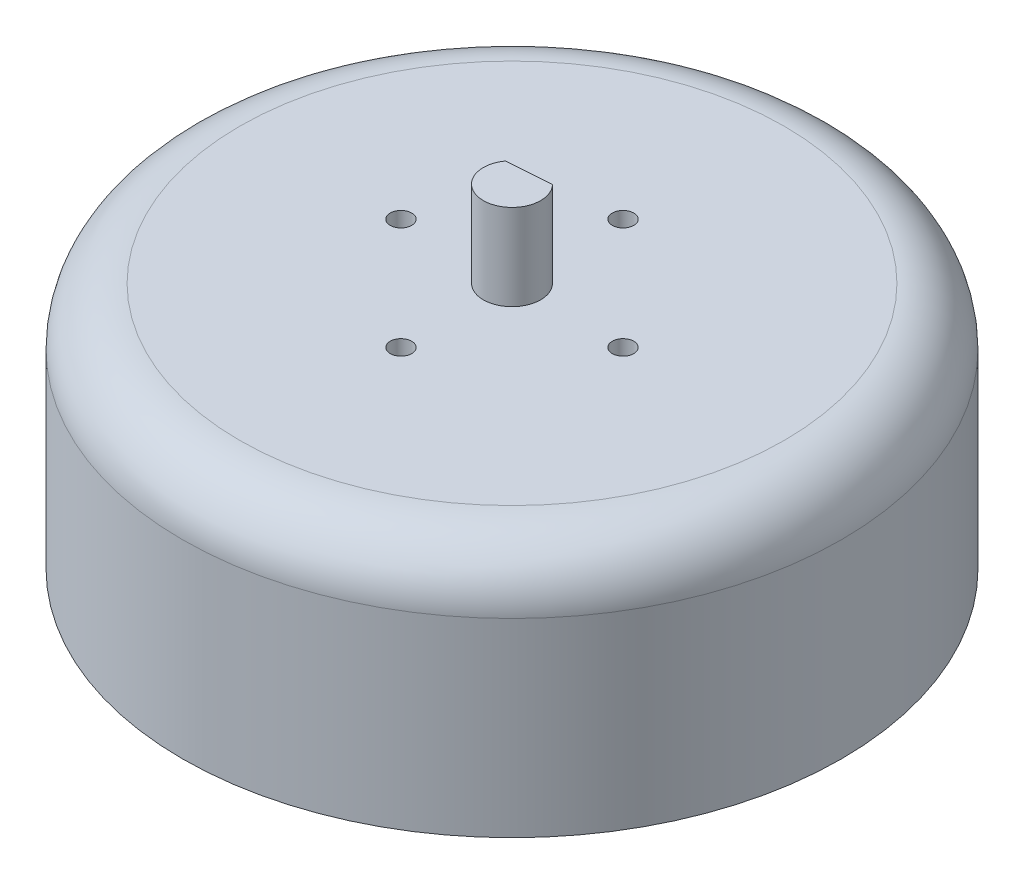
ISO-10303-21;
HEADER;
FILE_DESCRIPTION(('STEP AP214'),'2;1');
FILE_NAME('part.step','',(''),(''),'','','');
FILE_SCHEMA(('AUTOMOTIVE_DESIGN { 1 0 10303 214 1 1 1 1 }'));
ENDSEC;
DATA;
#1=APPLICATION_CONTEXT('core data for automotive mechanical design processes');
#2=APPLICATION_PROTOCOL_DEFINITION('international standard','automotive_design',2000,#1);
#3=PRODUCT_CONTEXT('',#1,'mechanical');
#4=PRODUCT('Part','Part','',(#3));
#5=PRODUCT_RELATED_PRODUCT_CATEGORY('part','',(#4));
#6=PRODUCT_DEFINITION_FORMATION('','',#4);
#7=PRODUCT_DEFINITION_CONTEXT('part definition',#1,'design');
#8=PRODUCT_DEFINITION('design','',#6,#7);
#9=PRODUCT_DEFINITION_SHAPE('','',#8);
#10=(LENGTH_UNIT() NAMED_UNIT(*) SI_UNIT(.MILLI.,.METRE.));
#11=(NAMED_UNIT(*) PLANE_ANGLE_UNIT() SI_UNIT($,.RADIAN.));
#12=(NAMED_UNIT(*) SI_UNIT($,.STERADIAN.) SOLID_ANGLE_UNIT());
#13=UNCERTAINTY_MEASURE_WITH_UNIT(LENGTH_MEASURE(1.E-05),#10,'distance_accuracy_value','');
#14=(GEOMETRIC_REPRESENTATION_CONTEXT(3) GLOBAL_UNCERTAINTY_ASSIGNED_CONTEXT((#13)) GLOBAL_UNIT_ASSIGNED_CONTEXT((#10,
#11,#12)) REPRESENTATION_CONTEXT('',''));
#15=CARTESIAN_POINT('',(0.,0.,0.));
#16=DIRECTION('',(0.,0.,1.));
#17=DIRECTION('',(1.,0.,0.));
#18=AXIS2_PLACEMENT_3D('',#15,#16,#17);
#19=CARTESIAN_POINT('',(0.,38.5,0.));
#20=DIRECTION('',(0.,-1.,0.));
#21=DIRECTION('',(0.,0.,-1.));
#22=AXIS2_PLACEMENT_3D('',#19,#20,#21);
#23=CYLINDRICAL_SURFACE('',#22,46.);
#24=CARTESIAN_POINT('',(0.,30.5,0.));
#25=DIRECTION('',(0.,-1.,0.));
#26=DIRECTION('',(0.,0.,-1.));
#27=AXIS2_PLACEMENT_3D('',#24,#25,#26);
#28=CIRCLE('',#27,46.);
#29=CARTESIAN_POINT('',(0.,30.5,-46.));
#30=VERTEX_POINT('',#29);
#31=EDGE_CURVE('E11',#30,#30,#28,.T.);
#32=ORIENTED_EDGE('',*,*,#31,.T.);
#33=EDGE_LOOP('',(#32));
#34=FACE_BOUND('',#33,.T.);
#35=CARTESIAN_POINT('',(0.,4.,0.));
#36=DIRECTION('',(0.,-1.,0.));
#37=DIRECTION('',(0.,0.,-1.));
#38=AXIS2_PLACEMENT_3D('',#35,#36,#37);
#39=CIRCLE('',#38,46.);
#40=CARTESIAN_POINT('',(0.,4.,-46.));
#41=VERTEX_POINT('',#40);
#42=EDGE_CURVE('E77',#41,#41,#39,.T.);
#43=ORIENTED_EDGE('',*,*,#42,.F.);
#44=EDGE_LOOP('',(#43));
#45=FACE_BOUND('',#44,.T.);
#46=ADVANCED_FACE('F33',(#34,#45),#23,.T.);
#47=CARTESIAN_POINT('',(0.,30.5,0.));
#48=DIRECTION('',(0.,-1.,0.));
#49=DIRECTION('',(0.,0.,-1.));
#50=AXIS2_PLACEMENT_3D('',#47,#48,#49);
#51=TOROIDAL_SURFACE('',#50,38.,8.);
#52=CARTESIAN_POINT('',(0.,38.5,0.));
#53=DIRECTION('',(0.,-1.,0.));
#54=DIRECTION('',(0.,0.,-1.));
#55=AXIS2_PLACEMENT_3D('',#52,#53,#54);
#56=CIRCLE('',#55,38.);
#57=CARTESIAN_POINT('',(0.,38.5,-38.));
#58=VERTEX_POINT('',#57);
#59=EDGE_CURVE('E40',#58,#58,#56,.T.);
#60=ORIENTED_EDGE('',*,*,#59,.T.);
#61=EDGE_LOOP('',(#60));
#62=FACE_BOUND('',#61,.T.);
#63=ORIENTED_EDGE('',*,*,#31,.F.);
#64=EDGE_LOOP('',(#63));
#65=FACE_BOUND('',#64,.T.);
#66=ADVANCED_FACE('F89',(#62,#65),#51,.T.);
#67=CARTESIAN_POINT('',(0.,38.5,0.));
#68=DIRECTION('',(0.,1.,0.));
#69=DIRECTION('',(0.,0.,1.));
#70=AXIS2_PLACEMENT_3D('',#67,#68,#69);
#71=PLANE('',#70);
#72=CARTESIAN_POINT('',(-15.5,38.5,0.));
#73=DIRECTION('',(0.,1.,0.));
#74=DIRECTION('',(0.,0.,1.));
#75=AXIS2_PLACEMENT_3D('',#72,#73,#74);
#76=CIRCLE('',#75,1.5);
#77=CARTESIAN_POINT('',(-15.5,38.5,1.5));
#78=VERTEX_POINT('',#77);
#79=EDGE_CURVE('E174',#78,#78,#76,.T.);
#80=ORIENTED_EDGE('',*,*,#79,.F.);
#81=EDGE_LOOP('',(#80));
#82=FACE_BOUND('',#81,.T.);
#83=CARTESIAN_POINT('',(0.,38.5,-15.5));
#84=DIRECTION('',(0.,1.,0.));
#85=DIRECTION('',(0.,0.,1.));
#86=AXIS2_PLACEMENT_3D('',#83,#84,#85);
#87=CIRCLE('',#86,1.5);
#88=CARTESIAN_POINT('',(0.,38.5,-14.));
#89=VERTEX_POINT('',#88);
#90=EDGE_CURVE('E180',#89,#89,#87,.T.);
#91=ORIENTED_EDGE('',*,*,#90,.F.);
#92=EDGE_LOOP('',(#91));
#93=FACE_BOUND('',#92,.T.);
#94=CARTESIAN_POINT('',(15.5,38.5,1.08235921504137E-13));
#95=DIRECTION('',(0.,1.,0.));
#96=DIRECTION('',(0.,0.,1.));
#97=AXIS2_PLACEMENT_3D('',#94,#95,#96);
#98=CIRCLE('',#97,1.5);
#99=CARTESIAN_POINT('',(15.5,38.5,1.50000000000011));
#100=VERTEX_POINT('',#99);
#101=EDGE_CURVE('E186',#100,#100,#98,.T.);
#102=ORIENTED_EDGE('',*,*,#101,.F.);
#103=EDGE_LOOP('',(#102));
#104=FACE_BOUND('',#103,.T.);
#105=CARTESIAN_POINT('',(-1.62353882256206E-13,38.5,15.5));
#106=DIRECTION('',(0.,1.,0.));
#107=DIRECTION('',(0.,0.,1.));
#108=AXIS2_PLACEMENT_3D('',#105,#106,#107);
#109=CIRCLE('',#108,1.5);
#110=CARTESIAN_POINT('',(-1.62353882256206E-13,38.5,17.));
#111=VERTEX_POINT('',#110);
#112=EDGE_CURVE('E70',#111,#111,#109,.T.);
#113=ORIENTED_EDGE('',*,*,#112,.F.);
#114=EDGE_LOOP('',(#113));
#115=FACE_BOUND('',#114,.T.);
#116=CARTESIAN_POINT('',(0.,38.5,0.));
#117=DIRECTION('',(0.,1.,0.));
#118=DIRECTION('',(0.,0.,1.));
#119=AXIS2_PLACEMENT_3D('',#116,#117,#118);
#120=CIRCLE('',#119,4.);
#121=CARTESIAN_POINT('',(0.,38.5,4.));
#122=VERTEX_POINT('',#121);
#123=EDGE_CURVE('E74',#122,#122,#120,.T.);
#124=ORIENTED_EDGE('',*,*,#123,.F.);
#125=EDGE_LOOP('',(#124));
#126=FACE_BOUND('',#125,.T.);
#127=ORIENTED_EDGE('',*,*,#59,.F.);
#128=EDGE_LOOP('',(#127));
#129=FACE_BOUND('',#128,.T.);
#130=ADVANCED_FACE('F92',(#82,#93,#104,#115,#126,#129),#71,.T.);
#131=CARTESIAN_POINT('',(0.,0.,0.));
#132=DIRECTION('',(0.,1.,0.));
#133=DIRECTION('',(0.,0.,1.));
#134=AXIS2_PLACEMENT_3D('',#131,#132,#133);
#135=CONICAL_SURFACE('',#134,31.,1.31019393504756);
#136=ORIENTED_EDGE('',*,*,#42,.T.);
#137=EDGE_LOOP('',(#136));
#138=FACE_BOUND('',#137,.T.);
#139=CARTESIAN_POINT('',(0.,0.,0.));
#140=DIRECTION('',(0.,-1.,0.));
#141=DIRECTION('',(0.,0.,-1.));
#142=AXIS2_PLACEMENT_3D('',#139,#140,#141);
#143=CIRCLE('',#142,31.);
#144=CARTESIAN_POINT('',(0.,0.,-31.));
#145=VERTEX_POINT('',#144);
#146=EDGE_CURVE('E73',#145,#145,#143,.T.);
#147=ORIENTED_EDGE('',*,*,#146,.F.);
#148=EDGE_LOOP('',(#147));
#149=FACE_BOUND('',#148,.T.);
#150=ADVANCED_FACE('F94',(#138,#149),#135,.T.);
#151=CARTESIAN_POINT('',(0.,0.,0.));
#152=DIRECTION('',(0.,1.,0.));
#153=DIRECTION('',(0.,0.,1.));
#154=AXIS2_PLACEMENT_3D('',#151,#152,#153);
#155=PLANE('',#154);
#156=ORIENTED_EDGE('',*,*,#146,.T.);
#157=EDGE_LOOP('',(#156));
#158=FACE_BOUND('',#157,.T.);
#159=ADVANCED_FACE('F101',(#158),#155,.F.);
#160=CARTESIAN_POINT('',(0.,50.5,0.));
#161=DIRECTION('',(0.,-1.,0.));
#162=DIRECTION('',(0.,0.,-1.));
#163=AXIS2_PLACEMENT_3D('',#160,#161,#162);
#164=CYLINDRICAL_SURFACE('',#163,4.);
#165=CARTESIAN_POINT('',(0.,50.5,0.));
#166=DIRECTION('',(0.,1.,0.));
#167=DIRECTION('',(0.,0.,1.));
#168=AXIS2_PLACEMENT_3D('',#165,#166,#167);
#169=CIRCLE('',#168,4.);
#170=CARTESIAN_POINT('',(-3.24918934267067,50.5,-2.33297419948771));
#171=VERTEX_POINT('',#170);
#172=CARTESIAN_POINT('',(2.89445528918943,50.5,-2.76082027283257));
#173=VERTEX_POINT('',#172);
#174=EDGE_CURVE('E69',#171,#173,#169,.T.);
#175=ORIENTED_EDGE('',*,*,#174,.F.);
#176=DIRECTION('',(0.,1.,0.));
#177=VECTOR('',#176,1.);
#178=CARTESIAN_POINT('',(-3.24918934267067,40.5,-2.33297419948771));
#179=LINE('',#178,#177);
#180=CARTESIAN_POINT('',(-3.24918934267067,40.5,-2.33297419948771));
#181=VERTEX_POINT('',#180);
#182=EDGE_CURVE('E47',#181,#171,#179,.T.);
#183=ORIENTED_EDGE('',*,*,#182,.F.);
#184=CARTESIAN_POINT('',(0.,40.5,0.));
#185=DIRECTION('',(0.,1.,0.));
#186=DIRECTION('',(0.,0.,1.));
#187=AXIS2_PLACEMENT_3D('',#184,#185,#186);
#188=CIRCLE('',#187,4.);
#189=CARTESIAN_POINT('',(2.89445528918943,40.5,-2.76082027283257));
#190=VERTEX_POINT('',#189);
#191=EDGE_CURVE('E63',#190,#181,#188,.T.);
#192=ORIENTED_EDGE('',*,*,#191,.F.);
#193=DIRECTION('',(0.,1.,0.));
#194=VECTOR('',#193,1.);
#195=CARTESIAN_POINT('',(2.89445528918943,40.5,-2.76082027283257));
#196=LINE('',#195,#194);
#197=EDGE_CURVE('E53',#190,#173,#196,.T.);
#198=ORIENTED_EDGE('',*,*,#197,.T.);
#199=EDGE_LOOP('',(#175,#183,#192,#198));
#200=FACE_BOUND('',#199,.T.);
#201=ORIENTED_EDGE('',*,*,#123,.T.);
#202=EDGE_LOOP('',(#201));
#203=FACE_BOUND('',#202,.T.);
#204=ADVANCED_FACE('F67',(#200,#203),#164,.T.);
#205=CARTESIAN_POINT('',(0.,50.5,0.));
#206=DIRECTION('',(0.,1.,0.));
#207=DIRECTION('',(0.,0.,1.));
#208=AXIS2_PLACEMENT_3D('',#205,#206,#207);
#209=PLANE('',#208);
#210=DIRECTION('',(0.997583889711977,0.,-0.0694721741931443));
#211=VECTOR('',#210,1.);
#212=CARTESIAN_POINT('',(-3.24918934267067,50.5,-2.33297419948771));
#213=LINE('',#212,#211);
#214=EDGE_CURVE('E58',#171,#173,#213,.T.);
#215=ORIENTED_EDGE('',*,*,#214,.F.);
#216=ORIENTED_EDGE('',*,*,#174,.T.);
#217=EDGE_LOOP('',(#215,#216));
#218=FACE_BOUND('',#217,.T.);
#219=ADVANCED_FACE('F72',(#218),#209,.T.);
#220=CARTESIAN_POINT('',(-1.62353882256206E-13,32.5,15.5));
#221=DIRECTION('',(0.,1.,0.));
#222=DIRECTION('',(0.,0.,1.));
#223=AXIS2_PLACEMENT_3D('',#220,#221,#222);
#224=CYLINDRICAL_SURFACE('',#223,1.5);
#225=CARTESIAN_POINT('',(-1.62353882256206E-13,32.5,15.5));
#226=DIRECTION('',(0.,1.,0.));
#227=DIRECTION('',(0.,0.,1.));
#228=AXIS2_PLACEMENT_3D('',#225,#226,#227);
#229=CIRCLE('',#228,1.5);
#230=CARTESIAN_POINT('',(-1.62353882256206E-13,32.5,17.));
#231=VERTEX_POINT('',#230);
#232=EDGE_CURVE('E188',#231,#231,#229,.T.);
#233=ORIENTED_EDGE('',*,*,#232,.F.);
#234=EDGE_LOOP('',(#233));
#235=FACE_BOUND('',#234,.T.);
#236=ORIENTED_EDGE('',*,*,#112,.T.);
#237=EDGE_LOOP('',(#236));
#238=FACE_BOUND('',#237,.T.);
#239=ADVANCED_FACE('F126',(#235,#238),#224,.F.);
#240=CARTESIAN_POINT('',(-1.62353882256206E-13,32.5,15.5));
#241=DIRECTION('',(0.,1.,0.));
#242=DIRECTION('',(0.,0.,1.));
#243=AXIS2_PLACEMENT_3D('',#240,#241,#242);
#244=PLANE('',#243);
#245=ORIENTED_EDGE('',*,*,#232,.T.);
#246=EDGE_LOOP('',(#245));
#247=FACE_BOUND('',#246,.T.);
#248=ADVANCED_FACE('F131',(#247),#244,.T.);
#249=CARTESIAN_POINT('',(15.5,32.5,1.08235921504137E-13));
#250=DIRECTION('',(0.,1.,0.));
#251=DIRECTION('',(0.,0.,1.));
#252=AXIS2_PLACEMENT_3D('',#249,#250,#251);
#253=CYLINDRICAL_SURFACE('',#252,1.5);
#254=CARTESIAN_POINT('',(15.5,32.5,1.08235921504137E-13));
#255=DIRECTION('',(0.,1.,0.));
#256=DIRECTION('',(0.,0.,1.));
#257=AXIS2_PLACEMENT_3D('',#254,#255,#256);
#258=CIRCLE('',#257,1.5);
#259=CARTESIAN_POINT('',(15.5,32.5,1.50000000000011));
#260=VERTEX_POINT('',#259);
#261=EDGE_CURVE('E183',#260,#260,#258,.T.);
#262=ORIENTED_EDGE('',*,*,#261,.F.);
#263=EDGE_LOOP('',(#262));
#264=FACE_BOUND('',#263,.T.);
#265=ORIENTED_EDGE('',*,*,#101,.T.);
#266=EDGE_LOOP('',(#265));
#267=FACE_BOUND('',#266,.T.);
#268=ADVANCED_FACE('F135',(#264,#267),#253,.F.);
#269=CARTESIAN_POINT('',(15.5,32.5,1.08235921504137E-13));
#270=DIRECTION('',(0.,1.,0.));
#271=DIRECTION('',(0.,0.,1.));
#272=AXIS2_PLACEMENT_3D('',#269,#270,#271);
#273=PLANE('',#272);
#274=ORIENTED_EDGE('',*,*,#261,.T.);
#275=EDGE_LOOP('',(#274));
#276=FACE_BOUND('',#275,.T.);
#277=ADVANCED_FACE('F139',(#276),#273,.T.);
#278=CARTESIAN_POINT('',(0.,32.5,-15.5));
#279=DIRECTION('',(0.,1.,0.));
#280=DIRECTION('',(0.,0.,1.));
#281=AXIS2_PLACEMENT_3D('',#278,#279,#280);
#282=CYLINDRICAL_SURFACE('',#281,1.5);
#283=CARTESIAN_POINT('',(0.,32.5,-15.5));
#284=DIRECTION('',(0.,1.,0.));
#285=DIRECTION('',(0.,0.,1.));
#286=AXIS2_PLACEMENT_3D('',#283,#284,#285);
#287=CIRCLE('',#286,1.5);
#288=CARTESIAN_POINT('',(0.,32.5,-14.));
#289=VERTEX_POINT('',#288);
#290=EDGE_CURVE('E177',#289,#289,#287,.T.);
#291=ORIENTED_EDGE('',*,*,#290,.F.);
#292=EDGE_LOOP('',(#291));
#293=FACE_BOUND('',#292,.T.);
#294=ORIENTED_EDGE('',*,*,#90,.T.);
#295=EDGE_LOOP('',(#294));
#296=FACE_BOUND('',#295,.T.);
#297=ADVANCED_FACE('F143',(#293,#296),#282,.F.);
#298=CARTESIAN_POINT('',(0.,32.5,-15.5));
#299=DIRECTION('',(0.,1.,0.));
#300=DIRECTION('',(0.,0.,1.));
#301=AXIS2_PLACEMENT_3D('',#298,#299,#300);
#302=PLANE('',#301);
#303=ORIENTED_EDGE('',*,*,#290,.T.);
#304=EDGE_LOOP('',(#303));
#305=FACE_BOUND('',#304,.T.);
#306=ADVANCED_FACE('F147',(#305),#302,.T.);
#307=CARTESIAN_POINT('',(-15.5,32.5,0.));
#308=DIRECTION('',(0.,1.,0.));
#309=DIRECTION('',(0.,0.,1.));
#310=AXIS2_PLACEMENT_3D('',#307,#308,#309);
#311=CYLINDRICAL_SURFACE('',#310,1.5);
#312=CARTESIAN_POINT('',(-15.5,32.5,0.));
#313=DIRECTION('',(0.,1.,0.));
#314=DIRECTION('',(0.,0.,1.));
#315=AXIS2_PLACEMENT_3D('',#312,#313,#314);
#316=CIRCLE('',#315,1.5);
#317=CARTESIAN_POINT('',(-15.5,32.5,1.5));
#318=VERTEX_POINT('',#317);
#319=EDGE_CURVE('E80',#318,#318,#316,.T.);
#320=ORIENTED_EDGE('',*,*,#319,.F.);
#321=EDGE_LOOP('',(#320));
#322=FACE_BOUND('',#321,.T.);
#323=ORIENTED_EDGE('',*,*,#79,.T.);
#324=EDGE_LOOP('',(#323));
#325=FACE_BOUND('',#324,.T.);
#326=ADVANCED_FACE('F151',(#322,#325),#311,.F.);
#327=CARTESIAN_POINT('',(-15.5,32.5,0.));
#328=DIRECTION('',(0.,1.,0.));
#329=DIRECTION('',(0.,0.,1.));
#330=AXIS2_PLACEMENT_3D('',#327,#328,#329);
#331=PLANE('',#330);
#332=ORIENTED_EDGE('',*,*,#319,.T.);
#333=EDGE_LOOP('',(#332));
#334=FACE_BOUND('',#333,.T.);
#335=ADVANCED_FACE('F155',(#334),#331,.T.);
#336=CARTESIAN_POINT('',(-3.24918934267067,40.5,-2.33297419948771));
#337=DIRECTION('',(0.0694721741931443,0.,0.997583889711977));
#338=DIRECTION('',(0.997583889711977,0.,-0.0694721741931443));
#339=AXIS2_PLACEMENT_3D('',#336,#337,#338);
#340=PLANE('',#339);
#341=ORIENTED_EDGE('',*,*,#214,.T.);
#342=ORIENTED_EDGE('',*,*,#197,.F.);
#343=DIRECTION('',(0.997583889711977,0.,-0.0694721741931443));
#344=VECTOR('',#343,1.);
#345=CARTESIAN_POINT('',(-3.24918934267067,40.5,-2.33297419948771));
#346=LINE('',#345,#344);
#347=EDGE_CURVE('E167',#181,#190,#346,.T.);
#348=ORIENTED_EDGE('',*,*,#347,.F.);
#349=ORIENTED_EDGE('',*,*,#182,.T.);
#350=EDGE_LOOP('',(#341,#342,#348,#349));
#351=FACE_BOUND('',#350,.T.);
#352=ADVANCED_FACE('F59',(#351),#340,.F.);
#353=CARTESIAN_POINT('',(0.,40.5,0.));
#354=DIRECTION('',(0.,1.,0.));
#355=DIRECTION('',(0.,0.,1.));
#356=AXIS2_PLACEMENT_3D('',#353,#354,#355);
#357=PLANE('',#356);
#358=ORIENTED_EDGE('',*,*,#191,.T.);
#359=ORIENTED_EDGE('',*,*,#347,.T.);
#360=EDGE_LOOP('',(#358,#359));
#361=FACE_BOUND('',#360,.T.);
#362=ADVANCED_FACE('F162',(#361),#357,.T.);
#363=CLOSED_SHELL('',(#46,#66,#130,#150,#159,#204,#219,#239,#248,#268,#277,#297,#306,#326,#335,
#352,#362));
#364=MANIFOLD_SOLID_BREP('B2',#363);
#365=ADVANCED_BREP_SHAPE_REPRESENTATION('',(#18,#364),#14);
#366=SHAPE_DEFINITION_REPRESENTATION(#9,#365);
ENDSEC;
END-ISO-10303-21;
